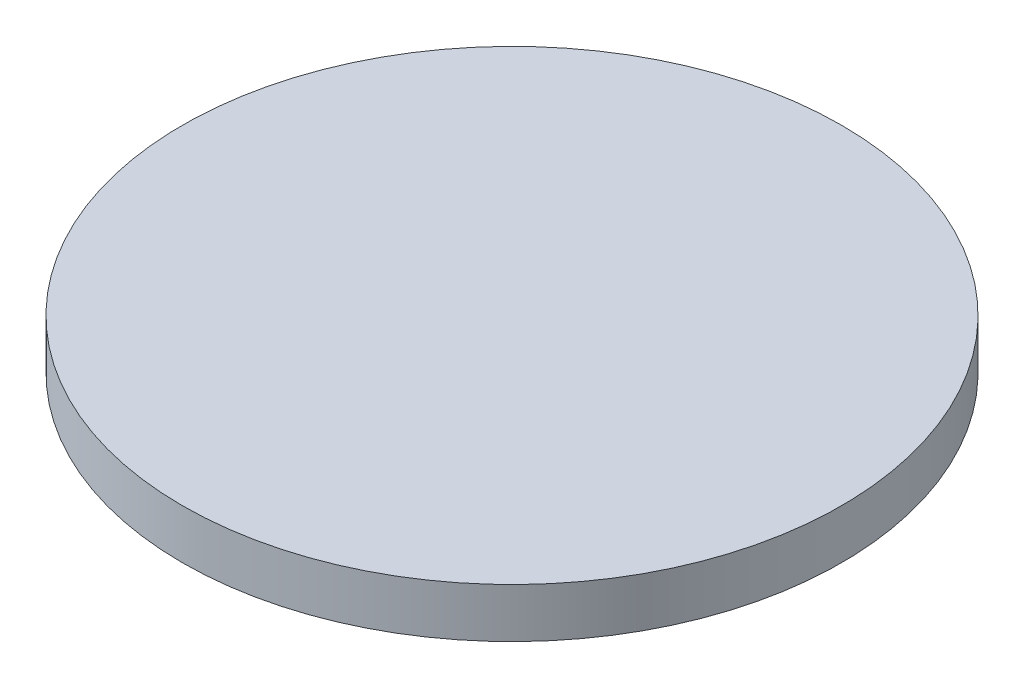
ISO-10303-21;
HEADER;
FILE_DESCRIPTION(('STEP AP214'),'2;1');
FILE_NAME('part.step','',(''),(''),'','','');
FILE_SCHEMA(('AUTOMOTIVE_DESIGN { 1 0 10303 214 1 1 1 1 }'));
ENDSEC;
DATA;
#1=APPLICATION_CONTEXT('core data for automotive mechanical design processes');
#2=APPLICATION_PROTOCOL_DEFINITION('international standard','automotive_design',2000,#1);
#3=PRODUCT_CONTEXT('',#1,'mechanical');
#4=PRODUCT('Part','Part','',(#3));
#5=PRODUCT_RELATED_PRODUCT_CATEGORY('part','',(#4));
#6=PRODUCT_DEFINITION_FORMATION('','',#4);
#7=PRODUCT_DEFINITION_CONTEXT('part definition',#1,'design');
#8=PRODUCT_DEFINITION('design','',#6,#7);
#9=PRODUCT_DEFINITION_SHAPE('','',#8);
#10=(LENGTH_UNIT() NAMED_UNIT(*) SI_UNIT(.MILLI.,.METRE.));
#11=(NAMED_UNIT(*) PLANE_ANGLE_UNIT() SI_UNIT($,.RADIAN.));
#12=(NAMED_UNIT(*) SI_UNIT($,.STERADIAN.) SOLID_ANGLE_UNIT());
#13=UNCERTAINTY_MEASURE_WITH_UNIT(LENGTH_MEASURE(1.E-05),#10,'distance_accuracy_value','');
#14=(GEOMETRIC_REPRESENTATION_CONTEXT(3) GLOBAL_UNCERTAINTY_ASSIGNED_CONTEXT((#13)) GLOBAL_UNIT_ASSIGNED_CONTEXT((#10,
#11,#12)) REPRESENTATION_CONTEXT('',''));
#15=CARTESIAN_POINT('',(0.,0.,0.));
#16=DIRECTION('',(0.,0.,1.));
#17=DIRECTION('',(1.,0.,0.));
#18=AXIS2_PLACEMENT_3D('',#15,#16,#17);
#19=CARTESIAN_POINT('',(0.,3.,0.));
#20=DIRECTION('',(0.,-1.,0.));
#21=DIRECTION('',(0.,0.,-1.));
#22=AXIS2_PLACEMENT_3D('',#19,#20,#21);
#23=CYLINDRICAL_SURFACE('',#22,20.);
#24=CARTESIAN_POINT('',(0.,3.,0.));
#25=DIRECTION('',(0.,1.,0.));
#26=DIRECTION('',(0.,0.,1.));
#27=AXIS2_PLACEMENT_3D('',#24,#25,#26);
#28=CIRCLE('',#27,20.);
#29=CARTESIAN_POINT('',(0.,3.,20.));
#30=VERTEX_POINT('',#29);
#31=EDGE_CURVE('E10',#30,#30,#28,.T.);
#32=ORIENTED_EDGE('',*,*,#31,.F.);
#33=EDGE_LOOP('',(#32));
#34=FACE_BOUND('',#33,.T.);
#35=CARTESIAN_POINT('',(0.,0.,0.));
#36=DIRECTION('',(0.,1.,0.));
#37=DIRECTION('',(0.,0.,1.));
#38=AXIS2_PLACEMENT_3D('',#35,#36,#37);
#39=CIRCLE('',#38,20.);
#40=CARTESIAN_POINT('',(0.,0.,20.));
#41=VERTEX_POINT('',#40);
#42=EDGE_CURVE('E40',#41,#41,#39,.T.);
#43=ORIENTED_EDGE('',*,*,#42,.T.);
#44=EDGE_LOOP('',(#43));
#45=FACE_BOUND('',#44,.T.);
#46=ADVANCED_FACE('F37',(#34,#45),#23,.T.);
#47=CARTESIAN_POINT('',(0.,3.,0.));
#48=DIRECTION('',(0.,1.,0.));
#49=DIRECTION('',(0.,0.,1.));
#50=AXIS2_PLACEMENT_3D('',#47,#48,#49);
#51=PLANE('',#50);
#52=ORIENTED_EDGE('',*,*,#31,.T.);
#53=EDGE_LOOP('',(#52));
#54=FACE_BOUND('',#53,.T.);
#55=ADVANCED_FACE('F54',(#54),#51,.T.);
#56=CARTESIAN_POINT('',(0.,0.,0.));
#57=DIRECTION('',(0.,1.,0.));
#58=DIRECTION('',(0.,0.,1.));
#59=AXIS2_PLACEMENT_3D('',#56,#57,#58);
#60=PLANE('',#59);
#61=ORIENTED_EDGE('',*,*,#42,.F.);
#62=EDGE_LOOP('',(#61));
#63=FACE_BOUND('',#62,.T.);
#64=ADVANCED_FACE('F52',(#63),#60,.F.);
#65=CLOSED_SHELL('',(#46,#55,#64));
#66=MANIFOLD_SOLID_BREP('B2',#65);
#67=ADVANCED_BREP_SHAPE_REPRESENTATION('',(#18,#66),#14);
#68=SHAPE_DEFINITION_REPRESENTATION(#9,#67);
ENDSEC;
END-ISO-10303-21;
